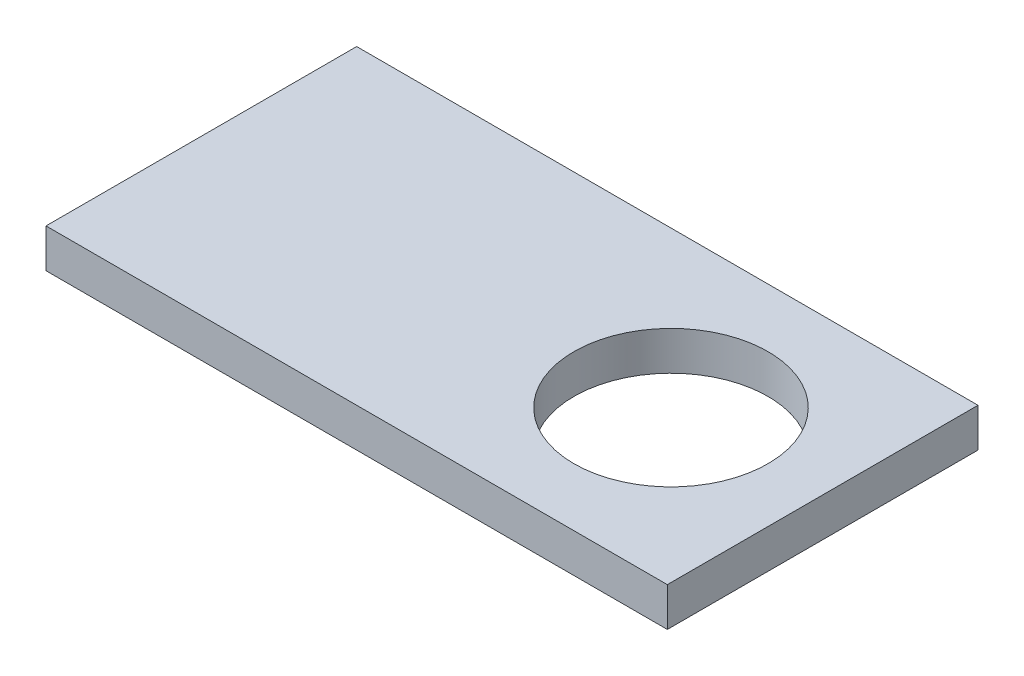
ISO-10303-21;
HEADER;
FILE_DESCRIPTION(('STEP AP214'),'2;1');
FILE_NAME('part.step','',(''),(''),'','','');
FILE_SCHEMA(('AUTOMOTIVE_DESIGN { 1 0 10303 214 1 1 1 1 }'));
ENDSEC;
DATA;
#1=APPLICATION_CONTEXT('core data for automotive mechanical design processes');
#2=APPLICATION_PROTOCOL_DEFINITION('international standard','automotive_design',2000,#1);
#3=PRODUCT_CONTEXT('',#1,'mechanical');
#4=PRODUCT('Part','Part','',(#3));
#5=PRODUCT_RELATED_PRODUCT_CATEGORY('part','',(#4));
#6=PRODUCT_DEFINITION_FORMATION('','',#4);
#7=PRODUCT_DEFINITION_CONTEXT('part definition',#1,'design');
#8=PRODUCT_DEFINITION('design','',#6,#7);
#9=PRODUCT_DEFINITION_SHAPE('','',#8);
#10=(LENGTH_UNIT() NAMED_UNIT(*) SI_UNIT(.MILLI.,.METRE.));
#11=(NAMED_UNIT(*) PLANE_ANGLE_UNIT() SI_UNIT($,.RADIAN.));
#12=(NAMED_UNIT(*) SI_UNIT($,.STERADIAN.) SOLID_ANGLE_UNIT());
#13=UNCERTAINTY_MEASURE_WITH_UNIT(LENGTH_MEASURE(1.E-05),#10,'distance_accuracy_value','');
#14=(GEOMETRIC_REPRESENTATION_CONTEXT(3) GLOBAL_UNCERTAINTY_ASSIGNED_CONTEXT((#13)) GLOBAL_UNIT_ASSIGNED_CONTEXT((#10,
#11,#12)) REPRESENTATION_CONTEXT('',''));
#15=CARTESIAN_POINT('',(0.,0.,0.));
#16=DIRECTION('',(0.,0.,1.));
#17=DIRECTION('',(1.,0.,0.));
#18=AXIS2_PLACEMENT_3D('',#15,#16,#17);
#19=CARTESIAN_POINT('',(0.,2.54,0.));
#20=DIRECTION('',(0.,-1.,0.));
#21=DIRECTION('',(0.,0.,-1.));
#22=AXIS2_PLACEMENT_3D('',#19,#20,#21);
#23=PLANE('',#22);
#24=DIRECTION('',(1.,0.,0.));
#25=VECTOR('',#24,1.);
#26=CARTESIAN_POINT('',(40.64,2.54,0.));
#27=LINE('',#26,#25);
#28=CARTESIAN_POINT('',(0.,2.54,0.));
#29=VERTEX_POINT('',#28);
#30=CARTESIAN_POINT('',(40.64,2.54,0.));
#31=VERTEX_POINT('',#30);
#32=EDGE_CURVE('E87',#29,#31,#27,.T.);
#33=ORIENTED_EDGE('',*,*,#32,.T.);
#34=DIRECTION('',(0.,0.,-1.));
#35=VECTOR('',#34,1.);
#36=CARTESIAN_POINT('',(40.64,2.54,-20.32));
#37=LINE('',#36,#35);
#38=CARTESIAN_POINT('',(40.64,2.54,-20.32));
#39=VERTEX_POINT('',#38);
#40=EDGE_CURVE('E82',#31,#39,#37,.T.);
#41=ORIENTED_EDGE('',*,*,#40,.T.);
#42=DIRECTION('',(-1.,0.,0.));
#43=VECTOR('',#42,1.);
#44=CARTESIAN_POINT('',(0.,2.54,-20.32));
#45=LINE('',#44,#43);
#46=CARTESIAN_POINT('',(0.,2.54,-20.32));
#47=VERTEX_POINT('',#46);
#48=EDGE_CURVE('E85',#39,#47,#45,.T.);
#49=ORIENTED_EDGE('',*,*,#48,.T.);
#50=DIRECTION('',(0.,0.,1.));
#51=VECTOR('',#50,1.);
#52=CARTESIAN_POINT('',(0.,2.54,0.));
#53=LINE('',#52,#51);
#54=EDGE_CURVE('E52',#47,#29,#53,.T.);
#55=ORIENTED_EDGE('',*,*,#54,.T.);
#56=EDGE_LOOP('',(#33,#41,#49,#55));
#57=FACE_BOUND('',#56,.T.);
#58=CARTESIAN_POINT('',(30.734,2.54,-10.1440138238184));
#59=DIRECTION('',(0.,1.,0.));
#60=DIRECTION('',(0.,0.,1.));
#61=AXIS2_PLACEMENT_3D('',#58,#59,#60);
#62=CIRCLE('',#61,6.35);
#63=CARTESIAN_POINT('',(30.734,2.54,-3.79401382381842));
#64=VERTEX_POINT('',#63);
#65=EDGE_CURVE('E102',#64,#64,#62,.T.);
#66=ORIENTED_EDGE('',*,*,#65,.F.);
#67=EDGE_LOOP('',(#66));
#68=FACE_BOUND('',#67,.T.);
#69=ADVANCED_FACE('F35',(#57,#68),#23,.F.);
#70=CARTESIAN_POINT('',(0.,0.,0.));
#71=DIRECTION('',(0.,-1.,0.));
#72=DIRECTION('',(0.,0.,-1.));
#73=AXIS2_PLACEMENT_3D('',#70,#71,#72);
#74=PLANE('',#73);
#75=DIRECTION('',(1.,0.,0.));
#76=VECTOR('',#75,1.);
#77=CARTESIAN_POINT('',(40.64,0.,0.));
#78=LINE('',#77,#76);
#79=CARTESIAN_POINT('',(0.,0.,0.));
#80=VERTEX_POINT('',#79);
#81=CARTESIAN_POINT('',(40.64,0.,0.));
#82=VERTEX_POINT('',#81);
#83=EDGE_CURVE('E99',#80,#82,#78,.T.);
#84=ORIENTED_EDGE('',*,*,#83,.F.);
#85=DIRECTION('',(0.,0.,1.));
#86=VECTOR('',#85,1.);
#87=CARTESIAN_POINT('',(0.,0.,0.));
#88=LINE('',#87,#86);
#89=CARTESIAN_POINT('',(0.,0.,-20.32));
#90=VERTEX_POINT('',#89);
#91=EDGE_CURVE('E75',#90,#80,#88,.T.);
#92=ORIENTED_EDGE('',*,*,#91,.F.);
#93=DIRECTION('',(-1.,0.,0.));
#94=VECTOR('',#93,1.);
#95=CARTESIAN_POINT('',(0.,0.,-20.32));
#96=LINE('',#95,#94);
#97=CARTESIAN_POINT('',(40.64,0.,-20.32));
#98=VERTEX_POINT('',#97);
#99=EDGE_CURVE('E69',#98,#90,#96,.T.);
#100=ORIENTED_EDGE('',*,*,#99,.F.);
#101=DIRECTION('',(0.,0.,-1.));
#102=VECTOR('',#101,1.);
#103=CARTESIAN_POINT('',(40.64,0.,-20.32));
#104=LINE('',#103,#102);
#105=EDGE_CURVE('E91',#82,#98,#104,.T.);
#106=ORIENTED_EDGE('',*,*,#105,.F.);
#107=EDGE_LOOP('',(#84,#92,#100,#106));
#108=FACE_BOUND('',#107,.T.);
#109=CARTESIAN_POINT('',(30.734,0.,-10.1440138238184));
#110=DIRECTION('',(0.,1.,0.));
#111=DIRECTION('',(0.,0.,1.));
#112=AXIS2_PLACEMENT_3D('',#109,#110,#111);
#113=CIRCLE('',#112,6.35);
#114=CARTESIAN_POINT('',(30.734,0.,-3.79401382381842));
#115=VERTEX_POINT('',#114);
#116=EDGE_CURVE('E114',#115,#115,#113,.T.);
#117=ORIENTED_EDGE('',*,*,#116,.T.);
#118=EDGE_LOOP('',(#117));
#119=FACE_BOUND('',#118,.T.);
#120=ADVANCED_FACE('F110',(#108,#119),#74,.T.);
#121=CARTESIAN_POINT('',(40.64,2.54,0.));
#122=DIRECTION('',(0.,0.,-1.));
#123=DIRECTION('',(-1.,0.,0.));
#124=AXIS2_PLACEMENT_3D('',#121,#122,#123);
#125=PLANE('',#124);
#126=ORIENTED_EDGE('',*,*,#83,.T.);
#127=DIRECTION('',(0.,-1.,0.));
#128=VECTOR('',#127,1.);
#129=CARTESIAN_POINT('',(40.64,2.54,0.));
#130=LINE('',#129,#128);
#131=EDGE_CURVE('E11',#31,#82,#130,.T.);
#132=ORIENTED_EDGE('',*,*,#131,.F.);
#133=ORIENTED_EDGE('',*,*,#32,.F.);
#134=DIRECTION('',(0.,-1.,0.));
#135=VECTOR('',#134,1.);
#136=CARTESIAN_POINT('',(0.,2.54,0.));
#137=LINE('',#136,#135);
#138=EDGE_CURVE('E95',#29,#80,#137,.T.);
#139=ORIENTED_EDGE('',*,*,#138,.T.);
#140=EDGE_LOOP('',(#126,#132,#133,#139));
#141=FACE_BOUND('',#140,.T.);
#142=ADVANCED_FACE('F37',(#141),#125,.F.);
#143=CARTESIAN_POINT('',(40.64,2.54,-20.32));
#144=DIRECTION('',(-1.,0.,0.));
#145=DIRECTION('',(0.,0.,1.));
#146=AXIS2_PLACEMENT_3D('',#143,#144,#145);
#147=PLANE('',#146);
#148=ORIENTED_EDGE('',*,*,#105,.T.);
#149=DIRECTION('',(0.,-1.,0.));
#150=VECTOR('',#149,1.);
#151=CARTESIAN_POINT('',(40.64,2.54,-20.32));
#152=LINE('',#151,#150);
#153=EDGE_CURVE('E44',#39,#98,#152,.T.);
#154=ORIENTED_EDGE('',*,*,#153,.F.);
#155=ORIENTED_EDGE('',*,*,#40,.F.);
#156=ORIENTED_EDGE('',*,*,#131,.T.);
#157=EDGE_LOOP('',(#148,#154,#155,#156));
#158=FACE_BOUND('',#157,.T.);
#159=ADVANCED_FACE('F90',(#158),#147,.F.);
#160=CARTESIAN_POINT('',(0.,2.54,-20.32));
#161=DIRECTION('',(0.,0.,1.));
#162=DIRECTION('',(1.,0.,0.));
#163=AXIS2_PLACEMENT_3D('',#160,#161,#162);
#164=PLANE('',#163);
#165=ORIENTED_EDGE('',*,*,#99,.T.);
#166=DIRECTION('',(0.,-1.,0.));
#167=VECTOR('',#166,1.);
#168=CARTESIAN_POINT('',(0.,2.54,-20.32));
#169=LINE('',#168,#167);
#170=EDGE_CURVE('E92',#47,#90,#169,.T.);
#171=ORIENTED_EDGE('',*,*,#170,.F.);
#172=ORIENTED_EDGE('',*,*,#48,.F.);
#173=ORIENTED_EDGE('',*,*,#153,.T.);
#174=EDGE_LOOP('',(#165,#171,#172,#173));
#175=FACE_BOUND('',#174,.T.);
#176=ADVANCED_FACE('F93',(#175),#164,.F.);
#177=CARTESIAN_POINT('',(0.,2.54,0.));
#178=DIRECTION('',(1.,0.,0.));
#179=DIRECTION('',(0.,0.,-1.));
#180=AXIS2_PLACEMENT_3D('',#177,#178,#179);
#181=PLANE('',#180);
#182=ORIENTED_EDGE('',*,*,#91,.T.);
#183=ORIENTED_EDGE('',*,*,#138,.F.);
#184=ORIENTED_EDGE('',*,*,#54,.F.);
#185=ORIENTED_EDGE('',*,*,#170,.T.);
#186=EDGE_LOOP('',(#182,#183,#184,#185));
#187=FACE_BOUND('',#186,.T.);
#188=ADVANCED_FACE('F107',(#187),#181,.F.);
#189=CARTESIAN_POINT('',(30.734,2.54,-10.1440138238184));
#190=DIRECTION('',(0.,-1.,0.));
#191=DIRECTION('',(0.,0.,-1.));
#192=AXIS2_PLACEMENT_3D('',#189,#190,#191);
#193=CYLINDRICAL_SURFACE('',#192,6.35);
#194=ORIENTED_EDGE('',*,*,#65,.T.);
#195=EDGE_LOOP('',(#194));
#196=FACE_BOUND('',#195,.T.);
#197=ORIENTED_EDGE('',*,*,#116,.F.);
#198=EDGE_LOOP('',(#197));
#199=FACE_BOUND('',#198,.T.);
#200=ADVANCED_FACE('F120',(#196,#199),#193,.F.);
#201=CLOSED_SHELL('',(#69,#120,#142,#159,#176,#188,#200));
#202=MANIFOLD_SOLID_BREP('B2',#201);
#203=ADVANCED_BREP_SHAPE_REPRESENTATION('',(#18,#202),#14);
#204=SHAPE_DEFINITION_REPRESENTATION(#9,#203);
ENDSEC;
END-ISO-10303-21;
